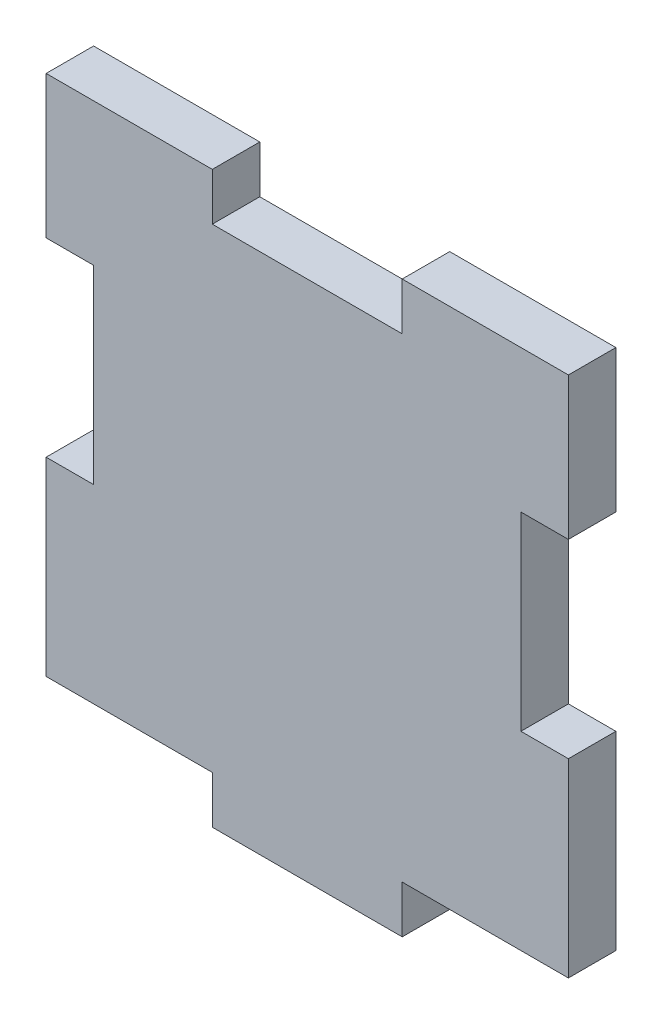
ISO-10303-21;
HEADER;
FILE_DESCRIPTION(('STEP AP214'),'2;1');
FILE_NAME('part.step','',(''),(''),'','','');
FILE_SCHEMA(('AUTOMOTIVE_DESIGN { 1 0 10303 214 1 1 1 1 }'));
ENDSEC;
DATA;
#1=APPLICATION_CONTEXT('core data for automotive mechanical design processes');
#2=APPLICATION_PROTOCOL_DEFINITION('international standard','automotive_design',2000,#1);
#3=PRODUCT_CONTEXT('',#1,'mechanical');
#4=PRODUCT('Part','Part','',(#3));
#5=PRODUCT_RELATED_PRODUCT_CATEGORY('part','',(#4));
#6=PRODUCT_DEFINITION_FORMATION('','',#4);
#7=PRODUCT_DEFINITION_CONTEXT('part definition',#1,'design');
#8=PRODUCT_DEFINITION('design','',#6,#7);
#9=PRODUCT_DEFINITION_SHAPE('','',#8);
#10=(LENGTH_UNIT() NAMED_UNIT(*) SI_UNIT(.MILLI.,.METRE.));
#11=(NAMED_UNIT(*) PLANE_ANGLE_UNIT() SI_UNIT($,.RADIAN.));
#12=(NAMED_UNIT(*) SI_UNIT($,.STERADIAN.) SOLID_ANGLE_UNIT());
#13=UNCERTAINTY_MEASURE_WITH_UNIT(LENGTH_MEASURE(1.E-05),#10,'distance_accuracy_value','');
#14=(GEOMETRIC_REPRESENTATION_CONTEXT(3) GLOBAL_UNCERTAINTY_ASSIGNED_CONTEXT((#13)) GLOBAL_UNIT_ASSIGNED_CONTEXT((#10,
#11,#12)) REPRESENTATION_CONTEXT('',''));
#15=CARTESIAN_POINT('',(0.,0.,0.));
#16=DIRECTION('',(0.,0.,1.));
#17=DIRECTION('',(1.,0.,0.));
#18=AXIS2_PLACEMENT_3D('',#15,#16,#17);
#19=CARTESIAN_POINT('',(0.,31.75,6.35));
#20=DIRECTION('',(1.,0.,0.));
#21=DIRECTION('',(0.,1.,0.));
#22=AXIS2_PLACEMENT_3D('',#19,#20,#21);
#23=PLANE('',#22);
#24=DIRECTION('',(0.,-1.,0.));
#25=VECTOR('',#24,1.);
#26=CARTESIAN_POINT('',(0.,31.75,0.));
#27=LINE('',#26,#25);
#28=CARTESIAN_POINT('',(0.,31.75,0.));
#29=VERTEX_POINT('',#28);
#30=CARTESIAN_POINT('',(0.,6.35,0.));
#31=VERTEX_POINT('',#30);
#32=EDGE_CURVE('E199',#29,#31,#27,.T.);
#33=ORIENTED_EDGE('',*,*,#32,.T.);
#34=DIRECTION('',(0.,0.,-1.));
#35=VECTOR('',#34,1.);
#36=CARTESIAN_POINT('',(0.,6.35,6.35));
#37=LINE('',#36,#35);
#38=CARTESIAN_POINT('',(0.,6.35,6.35));
#39=VERTEX_POINT('',#38);
#40=EDGE_CURVE('E11',#39,#31,#37,.T.);
#41=ORIENTED_EDGE('',*,*,#40,.F.);
#42=DIRECTION('',(0.,-1.,0.));
#43=VECTOR('',#42,1.);
#44=CARTESIAN_POINT('',(0.,31.75,6.35));
#45=LINE('',#44,#43);
#46=CARTESIAN_POINT('',(0.,31.75,6.35));
#47=VERTEX_POINT('',#46);
#48=EDGE_CURVE('E237',#47,#39,#45,.T.);
#49=ORIENTED_EDGE('',*,*,#48,.F.);
#50=DIRECTION('',(0.,0.,-1.));
#51=VECTOR('',#50,1.);
#52=CARTESIAN_POINT('',(0.,31.75,6.35));
#53=LINE('',#52,#51);
#54=EDGE_CURVE('E195',#47,#29,#53,.T.);
#55=ORIENTED_EDGE('',*,*,#54,.T.);
#56=EDGE_LOOP('',(#33,#41,#49,#55));
#57=FACE_BOUND('',#56,.T.);
#58=ADVANCED_FACE('F31',(#57),#23,.F.);
#59=CARTESIAN_POINT('',(0.,6.35,6.35));
#60=DIRECTION('',(0.,1.,0.));
#61=DIRECTION('',(-1.,0.,0.));
#62=AXIS2_PLACEMENT_3D('',#59,#60,#61);
#63=PLANE('',#62);
#64=DIRECTION('',(1.,0.,0.));
#65=VECTOR('',#64,1.);
#66=CARTESIAN_POINT('',(0.,6.35,0.));
#67=LINE('',#66,#65);
#68=CARTESIAN_POINT('',(22.225,6.34999999999999,0.));
#69=VERTEX_POINT('',#68);
#70=EDGE_CURVE('E202',#31,#69,#67,.T.);
#71=ORIENTED_EDGE('',*,*,#70,.T.);
#72=DIRECTION('',(0.,0.,-1.));
#73=VECTOR('',#72,1.);
#74=CARTESIAN_POINT('',(22.225,6.34999999999999,6.35));
#75=LINE('',#74,#73);
#76=CARTESIAN_POINT('',(22.225,6.34999999999999,6.35));
#77=VERTEX_POINT('',#76);
#78=EDGE_CURVE('E39',#77,#69,#75,.T.);
#79=ORIENTED_EDGE('',*,*,#78,.F.);
#80=DIRECTION('',(1.,0.,0.));
#81=VECTOR('',#80,1.);
#82=CARTESIAN_POINT('',(0.,6.35,6.35));
#83=LINE('',#82,#81);
#84=EDGE_CURVE('E126',#39,#77,#83,.T.);
#85=ORIENTED_EDGE('',*,*,#84,.F.);
#86=ORIENTED_EDGE('',*,*,#40,.T.);
#87=EDGE_LOOP('',(#71,#79,#85,#86));
#88=FACE_BOUND('',#87,.T.);
#89=ADVANCED_FACE('F355',(#88),#63,.F.);
#90=CARTESIAN_POINT('',(22.225,6.34999999999999,6.35));
#91=DIRECTION('',(1.,0.,0.));
#92=DIRECTION('',(0.,1.,0.));
#93=AXIS2_PLACEMENT_3D('',#90,#91,#92);
#94=PLANE('',#93);
#95=DIRECTION('',(0.,-1.,0.));
#96=VECTOR('',#95,1.);
#97=CARTESIAN_POINT('',(22.225,6.34999999999999,0.));
#98=LINE('',#97,#96);
#99=CARTESIAN_POINT('',(22.225,0.,0.));
#100=VERTEX_POINT('',#99);
#101=EDGE_CURVE('E204',#69,#100,#98,.T.);
#102=ORIENTED_EDGE('',*,*,#101,.T.);
#103=DIRECTION('',(0.,0.,-1.));
#104=VECTOR('',#103,1.);
#105=CARTESIAN_POINT('',(22.225,0.,6.35));
#106=LINE('',#105,#104);
#107=CARTESIAN_POINT('',(22.225,0.,6.35));
#108=VERTEX_POINT('',#107);
#109=EDGE_CURVE('E280',#108,#100,#106,.T.);
#110=ORIENTED_EDGE('',*,*,#109,.F.);
#111=DIRECTION('',(0.,-1.,0.));
#112=VECTOR('',#111,1.);
#113=CARTESIAN_POINT('',(22.225,6.34999999999999,6.35));
#114=LINE('',#113,#112);
#115=EDGE_CURVE('E288',#77,#108,#114,.T.);
#116=ORIENTED_EDGE('',*,*,#115,.F.);
#117=ORIENTED_EDGE('',*,*,#78,.T.);
#118=EDGE_LOOP('',(#102,#110,#116,#117));
#119=FACE_BOUND('',#118,.T.);
#120=ADVANCED_FACE('F286',(#119),#94,.F.);
#121=CARTESIAN_POINT('',(22.225,0.,6.35));
#122=DIRECTION('',(0.,1.,0.));
#123=DIRECTION('',(-1.,0.,0.));
#124=AXIS2_PLACEMENT_3D('',#121,#122,#123);
#125=PLANE('',#124);
#126=DIRECTION('',(1.,0.,0.));
#127=VECTOR('',#126,1.);
#128=CARTESIAN_POINT('',(22.225,0.,0.));
#129=LINE('',#128,#127);
#130=CARTESIAN_POINT('',(47.625,0.,0.));
#131=VERTEX_POINT('',#130);
#132=EDGE_CURVE('E206',#100,#131,#129,.T.);
#133=ORIENTED_EDGE('',*,*,#132,.T.);
#134=DIRECTION('',(0.,0.,-1.));
#135=VECTOR('',#134,1.);
#136=CARTESIAN_POINT('',(47.625,0.,6.35));
#137=LINE('',#136,#135);
#138=CARTESIAN_POINT('',(47.625,0.,6.35));
#139=VERTEX_POINT('',#138);
#140=EDGE_CURVE('E277',#139,#131,#137,.T.);
#141=ORIENTED_EDGE('',*,*,#140,.F.);
#142=DIRECTION('',(1.,0.,0.));
#143=VECTOR('',#142,1.);
#144=CARTESIAN_POINT('',(22.225,0.,6.35));
#145=LINE('',#144,#143);
#146=EDGE_CURVE('E306',#108,#139,#145,.T.);
#147=ORIENTED_EDGE('',*,*,#146,.F.);
#148=ORIENTED_EDGE('',*,*,#109,.T.);
#149=EDGE_LOOP('',(#133,#141,#147,#148));
#150=FACE_BOUND('',#149,.T.);
#151=ADVANCED_FACE('F297',(#150),#125,.F.);
#152=CARTESIAN_POINT('',(47.625,0.,6.35));
#153=DIRECTION('',(-1.,0.,0.));
#154=DIRECTION('',(0.,-1.,0.));
#155=AXIS2_PLACEMENT_3D('',#152,#153,#154);
#156=PLANE('',#155);
#157=DIRECTION('',(0.,1.,0.));
#158=VECTOR('',#157,1.);
#159=CARTESIAN_POINT('',(47.625,0.,0.));
#160=LINE('',#159,#158);
#161=CARTESIAN_POINT('',(47.625,6.35,0.));
#162=VERTEX_POINT('',#161);
#163=EDGE_CURVE('E208',#131,#162,#160,.T.);
#164=ORIENTED_EDGE('',*,*,#163,.T.);
#165=DIRECTION('',(0.,0.,-1.));
#166=VECTOR('',#165,1.);
#167=CARTESIAN_POINT('',(47.625,6.35,6.35));
#168=LINE('',#167,#166);
#169=CARTESIAN_POINT('',(47.625,6.35,6.35));
#170=VERTEX_POINT('',#169);
#171=EDGE_CURVE('E274',#170,#162,#168,.T.);
#172=ORIENTED_EDGE('',*,*,#171,.F.);
#173=DIRECTION('',(0.,1.,0.));
#174=VECTOR('',#173,1.);
#175=CARTESIAN_POINT('',(47.625,0.,6.35));
#176=LINE('',#175,#174);
#177=EDGE_CURVE('E303',#139,#170,#176,.T.);
#178=ORIENTED_EDGE('',*,*,#177,.F.);
#179=ORIENTED_EDGE('',*,*,#140,.T.);
#180=EDGE_LOOP('',(#164,#172,#178,#179));
#181=FACE_BOUND('',#180,.T.);
#182=ADVANCED_FACE('F301',(#181),#156,.F.);
#183=CARTESIAN_POINT('',(47.625,6.35,6.35));
#184=DIRECTION('',(0.,1.,0.));
#185=DIRECTION('',(-1.,0.,0.));
#186=AXIS2_PLACEMENT_3D('',#183,#184,#185);
#187=PLANE('',#186);
#188=DIRECTION('',(1.,0.,0.));
#189=VECTOR('',#188,1.);
#190=CARTESIAN_POINT('',(47.625,6.35,0.));
#191=LINE('',#190,#189);
#192=CARTESIAN_POINT('',(69.85,6.35,0.));
#193=VERTEX_POINT('',#192);
#194=EDGE_CURVE('E210',#162,#193,#191,.T.);
#195=ORIENTED_EDGE('',*,*,#194,.T.);
#196=DIRECTION('',(0.,0.,-1.));
#197=VECTOR('',#196,1.);
#198=CARTESIAN_POINT('',(69.85,6.35,6.35));
#199=LINE('',#198,#197);
#200=CARTESIAN_POINT('',(69.85,6.35,6.35));
#201=VERTEX_POINT('',#200);
#202=EDGE_CURVE('E271',#201,#193,#199,.T.);
#203=ORIENTED_EDGE('',*,*,#202,.F.);
#204=DIRECTION('',(1.,0.,0.));
#205=VECTOR('',#204,1.);
#206=CARTESIAN_POINT('',(47.625,6.35,6.35));
#207=LINE('',#206,#205);
#208=EDGE_CURVE('E305',#170,#201,#207,.T.);
#209=ORIENTED_EDGE('',*,*,#208,.F.);
#210=ORIENTED_EDGE('',*,*,#171,.T.);
#211=EDGE_LOOP('',(#195,#203,#209,#210));
#212=FACE_BOUND('',#211,.T.);
#213=ADVANCED_FACE('F368',(#212),#187,.F.);
#214=CARTESIAN_POINT('',(69.85,6.35,6.35));
#215=DIRECTION('',(-1.,0.,0.));
#216=DIRECTION('',(0.,0.,1.));
#217=AXIS2_PLACEMENT_3D('',#214,#215,#216);
#218=PLANE('',#217);
#219=DIRECTION('',(0.,1.,0.));
#220=VECTOR('',#219,1.);
#221=CARTESIAN_POINT('',(69.85,6.35,0.));
#222=LINE('',#221,#220);
#223=CARTESIAN_POINT('',(69.85,31.75,0.));
#224=VERTEX_POINT('',#223);
#225=EDGE_CURVE('E212',#193,#224,#222,.T.);
#226=ORIENTED_EDGE('',*,*,#225,.T.);
#227=DIRECTION('',(0.,0.,-1.));
#228=VECTOR('',#227,1.);
#229=CARTESIAN_POINT('',(69.85,31.75,6.35));
#230=LINE('',#229,#228);
#231=CARTESIAN_POINT('',(69.85,31.75,6.35));
#232=VERTEX_POINT('',#231);
#233=EDGE_CURVE('E268',#232,#224,#230,.T.);
#234=ORIENTED_EDGE('',*,*,#233,.F.);
#235=DIRECTION('',(0.,1.,0.));
#236=VECTOR('',#235,1.);
#237=CARTESIAN_POINT('',(69.85,6.35,6.35));
#238=LINE('',#237,#236);
#239=EDGE_CURVE('E308',#201,#232,#238,.T.);
#240=ORIENTED_EDGE('',*,*,#239,.F.);
#241=ORIENTED_EDGE('',*,*,#202,.T.);
#242=EDGE_LOOP('',(#226,#234,#240,#241));
#243=FACE_BOUND('',#242,.T.);
#244=ADVANCED_FACE('F371',(#243),#218,.F.);
#245=CARTESIAN_POINT('',(63.5,31.75,6.35));
#246=DIRECTION('',(0.,-1.,0.));
#247=DIRECTION('',(1.,0.,0.));
#248=AXIS2_PLACEMENT_3D('',#245,#246,#247);
#249=PLANE('',#248);
#250=DIRECTION('',(-1.,0.,0.));
#251=VECTOR('',#250,1.);
#252=CARTESIAN_POINT('',(63.5,31.75,0.));
#253=LINE('',#252,#251);
#254=CARTESIAN_POINT('',(63.5,31.75,0.));
#255=VERTEX_POINT('',#254);
#256=EDGE_CURVE('E214',#224,#255,#253,.T.);
#257=ORIENTED_EDGE('',*,*,#256,.T.);
#258=DIRECTION('',(0.,0.,-1.));
#259=VECTOR('',#258,1.);
#260=CARTESIAN_POINT('',(63.5,31.75,6.35));
#261=LINE('',#260,#259);
#262=CARTESIAN_POINT('',(63.5,31.75,6.35));
#263=VERTEX_POINT('',#262);
#264=EDGE_CURVE('E265',#263,#255,#261,.T.);
#265=ORIENTED_EDGE('',*,*,#264,.F.);
#266=DIRECTION('',(-1.,0.,0.));
#267=VECTOR('',#266,1.);
#268=CARTESIAN_POINT('',(63.5,31.75,6.35));
#269=LINE('',#268,#267);
#270=EDGE_CURVE('E314',#232,#263,#269,.T.);
#271=ORIENTED_EDGE('',*,*,#270,.F.);
#272=ORIENTED_EDGE('',*,*,#233,.T.);
#273=EDGE_LOOP('',(#257,#265,#271,#272));
#274=FACE_BOUND('',#273,.T.);
#275=ADVANCED_FACE('F375',(#274),#249,.F.);
#276=CARTESIAN_POINT('',(63.5,57.15,6.35));
#277=DIRECTION('',(-1.,0.,0.));
#278=DIRECTION('',(0.,-1.,0.));
#279=AXIS2_PLACEMENT_3D('',#276,#277,#278);
#280=PLANE('',#279);
#281=DIRECTION('',(0.,1.,0.));
#282=VECTOR('',#281,1.);
#283=CARTESIAN_POINT('',(63.5,57.15,0.));
#284=LINE('',#283,#282);
#285=CARTESIAN_POINT('',(63.5,57.15,0.));
#286=VERTEX_POINT('',#285);
#287=EDGE_CURVE('E216',#255,#286,#284,.T.);
#288=ORIENTED_EDGE('',*,*,#287,.T.);
#289=DIRECTION('',(0.,0.,-1.));
#290=VECTOR('',#289,1.);
#291=CARTESIAN_POINT('',(63.5,57.15,6.35));
#292=LINE('',#291,#290);
#293=CARTESIAN_POINT('',(63.5,57.15,6.35));
#294=VERTEX_POINT('',#293);
#295=EDGE_CURVE('E262',#294,#286,#292,.T.);
#296=ORIENTED_EDGE('',*,*,#295,.F.);
#297=DIRECTION('',(0.,1.,0.));
#298=VECTOR('',#297,1.);
#299=CARTESIAN_POINT('',(63.5,57.15,6.35));
#300=LINE('',#299,#298);
#301=EDGE_CURVE('E316',#263,#294,#300,.T.);
#302=ORIENTED_EDGE('',*,*,#301,.F.);
#303=ORIENTED_EDGE('',*,*,#264,.T.);
#304=EDGE_LOOP('',(#288,#296,#302,#303));
#305=FACE_BOUND('',#304,.T.);
#306=ADVANCED_FACE('F379',(#305),#280,.F.);
#307=CARTESIAN_POINT('',(69.85,57.15,6.35));
#308=DIRECTION('',(0.,1.,0.));
#309=DIRECTION('',(-1.,0.,0.));
#310=AXIS2_PLACEMENT_3D('',#307,#308,#309);
#311=PLANE('',#310);
#312=DIRECTION('',(1.,0.,0.));
#313=VECTOR('',#312,1.);
#314=CARTESIAN_POINT('',(69.85,57.15,0.));
#315=LINE('',#314,#313);
#316=CARTESIAN_POINT('',(69.85,57.15,0.));
#317=VERTEX_POINT('',#316);
#318=EDGE_CURVE('E218',#286,#317,#315,.T.);
#319=ORIENTED_EDGE('',*,*,#318,.T.);
#320=DIRECTION('',(0.,0.,-1.));
#321=VECTOR('',#320,1.);
#322=CARTESIAN_POINT('',(69.85,57.15,6.35));
#323=LINE('',#322,#321);
#324=CARTESIAN_POINT('',(69.85,57.15,6.35));
#325=VERTEX_POINT('',#324);
#326=EDGE_CURVE('E259',#325,#317,#323,.T.);
#327=ORIENTED_EDGE('',*,*,#326,.F.);
#328=DIRECTION('',(1.,0.,0.));
#329=VECTOR('',#328,1.);
#330=CARTESIAN_POINT('',(69.85,57.15,6.35));
#331=LINE('',#330,#329);
#332=EDGE_CURVE('E318',#294,#325,#331,.T.);
#333=ORIENTED_EDGE('',*,*,#332,.F.);
#334=ORIENTED_EDGE('',*,*,#295,.T.);
#335=EDGE_LOOP('',(#319,#327,#333,#334));
#336=FACE_BOUND('',#335,.T.);
#337=ADVANCED_FACE('F383',(#336),#311,.F.);
#338=CARTESIAN_POINT('',(69.85,57.15,6.35));
#339=DIRECTION('',(-1.,0.,0.));
#340=DIRECTION('',(0.,0.,1.));
#341=AXIS2_PLACEMENT_3D('',#338,#339,#340);
#342=PLANE('',#341);
#343=DIRECTION('',(0.,1.,0.));
#344=VECTOR('',#343,1.);
#345=CARTESIAN_POINT('',(69.85,57.15,0.));
#346=LINE('',#345,#344);
#347=CARTESIAN_POINT('',(69.85,76.2,0.));
#348=VERTEX_POINT('',#347);
#349=EDGE_CURVE('E220',#317,#348,#346,.T.);
#350=ORIENTED_EDGE('',*,*,#349,.T.);
#351=DIRECTION('',(0.,0.,-1.));
#352=VECTOR('',#351,1.);
#353=CARTESIAN_POINT('',(69.85,76.2,6.35));
#354=LINE('',#353,#352);
#355=CARTESIAN_POINT('',(69.85,76.2,6.35));
#356=VERTEX_POINT('',#355);
#357=EDGE_CURVE('E256',#356,#348,#354,.T.);
#358=ORIENTED_EDGE('',*,*,#357,.F.);
#359=DIRECTION('',(0.,1.,0.));
#360=VECTOR('',#359,1.);
#361=CARTESIAN_POINT('',(69.85,57.15,6.35));
#362=LINE('',#361,#360);
#363=EDGE_CURVE('E320',#325,#356,#362,.T.);
#364=ORIENTED_EDGE('',*,*,#363,.F.);
#365=ORIENTED_EDGE('',*,*,#326,.T.);
#366=EDGE_LOOP('',(#350,#358,#364,#365));
#367=FACE_BOUND('',#366,.T.);
#368=ADVANCED_FACE('F387',(#367),#342,.F.);
#369=CARTESIAN_POINT('',(69.85,76.2,6.35));
#370=DIRECTION('',(0.,-1.,0.));
#371=DIRECTION('',(1.,0.,0.));
#372=AXIS2_PLACEMENT_3D('',#369,#370,#371);
#373=PLANE('',#372);
#374=DIRECTION('',(-1.,0.,0.));
#375=VECTOR('',#374,1.);
#376=CARTESIAN_POINT('',(69.85,76.2,0.));
#377=LINE('',#376,#375);
#378=CARTESIAN_POINT('',(47.625,76.2,0.));
#379=VERTEX_POINT('',#378);
#380=EDGE_CURVE('E222',#348,#379,#377,.T.);
#381=ORIENTED_EDGE('',*,*,#380,.T.);
#382=DIRECTION('',(0.,0.,-1.));
#383=VECTOR('',#382,1.);
#384=CARTESIAN_POINT('',(47.625,76.2,6.35));
#385=LINE('',#384,#383);
#386=CARTESIAN_POINT('',(47.625,76.2,6.35));
#387=VERTEX_POINT('',#386);
#388=EDGE_CURVE('E253',#387,#379,#385,.T.);
#389=ORIENTED_EDGE('',*,*,#388,.F.);
#390=DIRECTION('',(-1.,0.,0.));
#391=VECTOR('',#390,1.);
#392=CARTESIAN_POINT('',(69.85,76.2,6.35));
#393=LINE('',#392,#391);
#394=EDGE_CURVE('E322',#356,#387,#393,.T.);
#395=ORIENTED_EDGE('',*,*,#394,.F.);
#396=ORIENTED_EDGE('',*,*,#357,.T.);
#397=EDGE_LOOP('',(#381,#389,#395,#396));
#398=FACE_BOUND('',#397,.T.);
#399=ADVANCED_FACE('F391',(#398),#373,.F.);
#400=CARTESIAN_POINT('',(47.625,69.85,6.35));
#401=DIRECTION('',(1.,0.,0.));
#402=DIRECTION('',(0.,1.,0.));
#403=AXIS2_PLACEMENT_3D('',#400,#401,#402);
#404=PLANE('',#403);
#405=DIRECTION('',(0.,-1.,0.));
#406=VECTOR('',#405,1.);
#407=CARTESIAN_POINT('',(47.625,69.85,0.));
#408=LINE('',#407,#406);
#409=CARTESIAN_POINT('',(47.625,69.85,0.));
#410=VERTEX_POINT('',#409);
#411=EDGE_CURVE('E224',#379,#410,#408,.T.);
#412=ORIENTED_EDGE('',*,*,#411,.T.);
#413=DIRECTION('',(0.,0.,-1.));
#414=VECTOR('',#413,1.);
#415=CARTESIAN_POINT('',(47.625,69.85,6.35));
#416=LINE('',#415,#414);
#417=CARTESIAN_POINT('',(47.625,69.85,6.35));
#418=VERTEX_POINT('',#417);
#419=EDGE_CURVE('E250',#418,#410,#416,.T.);
#420=ORIENTED_EDGE('',*,*,#419,.F.);
#421=DIRECTION('',(0.,-1.,0.));
#422=VECTOR('',#421,1.);
#423=CARTESIAN_POINT('',(47.625,69.85,6.35));
#424=LINE('',#423,#422);
#425=EDGE_CURVE('E324',#387,#418,#424,.T.);
#426=ORIENTED_EDGE('',*,*,#425,.F.);
#427=ORIENTED_EDGE('',*,*,#388,.T.);
#428=EDGE_LOOP('',(#412,#420,#426,#427));
#429=FACE_BOUND('',#428,.T.);
#430=ADVANCED_FACE('F395',(#429),#404,.F.);
#431=CARTESIAN_POINT('',(22.225,69.85,6.35));
#432=DIRECTION('',(0.,-1.,0.));
#433=DIRECTION('',(0.,0.,-1.));
#434=AXIS2_PLACEMENT_3D('',#431,#432,#433);
#435=PLANE('',#434);
#436=DIRECTION('',(-1.,0.,0.));
#437=VECTOR('',#436,1.);
#438=CARTESIAN_POINT('',(22.225,69.85,0.));
#439=LINE('',#438,#437);
#440=CARTESIAN_POINT('',(22.225,69.85,0.));
#441=VERTEX_POINT('',#440);
#442=EDGE_CURVE('E226',#410,#441,#439,.T.);
#443=ORIENTED_EDGE('',*,*,#442,.T.);
#444=DIRECTION('',(0.,0.,-1.));
#445=VECTOR('',#444,1.);
#446=CARTESIAN_POINT('',(22.225,69.85,6.35));
#447=LINE('',#446,#445);
#448=CARTESIAN_POINT('',(22.225,69.85,6.35));
#449=VERTEX_POINT('',#448);
#450=EDGE_CURVE('E247',#449,#441,#447,.T.);
#451=ORIENTED_EDGE('',*,*,#450,.F.);
#452=DIRECTION('',(-1.,0.,0.));
#453=VECTOR('',#452,1.);
#454=CARTESIAN_POINT('',(22.225,69.85,6.35));
#455=LINE('',#454,#453);
#456=EDGE_CURVE('E326',#418,#449,#455,.T.);
#457=ORIENTED_EDGE('',*,*,#456,.F.);
#458=ORIENTED_EDGE('',*,*,#419,.T.);
#459=EDGE_LOOP('',(#443,#451,#457,#458));
#460=FACE_BOUND('',#459,.T.);
#461=ADVANCED_FACE('F399',(#460),#435,.F.);
#462=CARTESIAN_POINT('',(22.225,76.2,6.35));
#463=DIRECTION('',(-1.,0.,0.));
#464=DIRECTION('',(0.,-1.,0.));
#465=AXIS2_PLACEMENT_3D('',#462,#463,#464);
#466=PLANE('',#465);
#467=DIRECTION('',(0.,1.,0.));
#468=VECTOR('',#467,1.);
#469=CARTESIAN_POINT('',(22.225,76.2,0.));
#470=LINE('',#469,#468);
#471=CARTESIAN_POINT('',(22.225,76.2,0.));
#472=VERTEX_POINT('',#471);
#473=EDGE_CURVE('E228',#441,#472,#470,.T.);
#474=ORIENTED_EDGE('',*,*,#473,.T.);
#475=DIRECTION('',(0.,0.,-1.));
#476=VECTOR('',#475,1.);
#477=CARTESIAN_POINT('',(22.225,76.2,6.35));
#478=LINE('',#477,#476);
#479=CARTESIAN_POINT('',(22.225,76.2,6.35));
#480=VERTEX_POINT('',#479);
#481=EDGE_CURVE('E244',#480,#472,#478,.T.);
#482=ORIENTED_EDGE('',*,*,#481,.F.);
#483=DIRECTION('',(0.,1.,0.));
#484=VECTOR('',#483,1.);
#485=CARTESIAN_POINT('',(22.225,76.2,6.35));
#486=LINE('',#485,#484);
#487=EDGE_CURVE('E328',#449,#480,#486,.T.);
#488=ORIENTED_EDGE('',*,*,#487,.F.);
#489=ORIENTED_EDGE('',*,*,#450,.T.);
#490=EDGE_LOOP('',(#474,#482,#488,#489));
#491=FACE_BOUND('',#490,.T.);
#492=ADVANCED_FACE('F403',(#491),#466,.F.);
#493=CARTESIAN_POINT('',(22.225,76.2,6.35));
#494=DIRECTION('',(0.,-1.,0.));
#495=DIRECTION('',(0.,0.,-1.));
#496=AXIS2_PLACEMENT_3D('',#493,#494,#495);
#497=PLANE('',#496);
#498=DIRECTION('',(-1.,0.,0.));
#499=VECTOR('',#498,1.);
#500=CARTESIAN_POINT('',(22.225,76.2,0.));
#501=LINE('',#500,#499);
#502=CARTESIAN_POINT('',(0.,76.2,0.));
#503=VERTEX_POINT('',#502);
#504=EDGE_CURVE('E230',#472,#503,#501,.T.);
#505=ORIENTED_EDGE('',*,*,#504,.T.);
#506=DIRECTION('',(0.,0.,-1.));
#507=VECTOR('',#506,1.);
#508=CARTESIAN_POINT('',(0.,76.2,6.35));
#509=LINE('',#508,#507);
#510=CARTESIAN_POINT('',(0.,76.2,6.35));
#511=VERTEX_POINT('',#510);
#512=EDGE_CURVE('E241',#511,#503,#509,.T.);
#513=ORIENTED_EDGE('',*,*,#512,.F.);
#514=DIRECTION('',(-1.,0.,0.));
#515=VECTOR('',#514,1.);
#516=CARTESIAN_POINT('',(22.225,76.2,6.35));
#517=LINE('',#516,#515);
#518=EDGE_CURVE('E330',#480,#511,#517,.T.);
#519=ORIENTED_EDGE('',*,*,#518,.F.);
#520=ORIENTED_EDGE('',*,*,#481,.T.);
#521=EDGE_LOOP('',(#505,#513,#519,#520));
#522=FACE_BOUND('',#521,.T.);
#523=ADVANCED_FACE('F336',(#522),#497,.F.);
#524=CARTESIAN_POINT('',(0.,76.2,6.35));
#525=DIRECTION('',(1.,0.,0.));
#526=DIRECTION('',(0.,1.,0.));
#527=AXIS2_PLACEMENT_3D('',#524,#525,#526);
#528=PLANE('',#527);
#529=DIRECTION('',(0.,-1.,0.));
#530=VECTOR('',#529,1.);
#531=CARTESIAN_POINT('',(0.,76.2,0.));
#532=LINE('',#531,#530);
#533=CARTESIAN_POINT('',(0.,57.15,0.));
#534=VERTEX_POINT('',#533);
#535=EDGE_CURVE('E232',#503,#534,#532,.T.);
#536=ORIENTED_EDGE('',*,*,#535,.T.);
#537=DIRECTION('',(0.,0.,-1.));
#538=VECTOR('',#537,1.);
#539=CARTESIAN_POINT('',(0.,57.15,6.35));
#540=LINE('',#539,#538);
#541=CARTESIAN_POINT('',(0.,57.15,6.35));
#542=VERTEX_POINT('',#541);
#543=EDGE_CURVE('E190',#542,#534,#540,.T.);
#544=ORIENTED_EDGE('',*,*,#543,.F.);
#545=DIRECTION('',(0.,-1.,0.));
#546=VECTOR('',#545,1.);
#547=CARTESIAN_POINT('',(0.,76.2,6.35));
#548=LINE('',#547,#546);
#549=EDGE_CURVE('E181',#511,#542,#548,.T.);
#550=ORIENTED_EDGE('',*,*,#549,.F.);
#551=ORIENTED_EDGE('',*,*,#512,.T.);
#552=EDGE_LOOP('',(#536,#544,#550,#551));
#553=FACE_BOUND('',#552,.T.);
#554=ADVANCED_FACE('F340',(#553),#528,.F.);
#555=CARTESIAN_POINT('',(0.,57.15,6.35));
#556=DIRECTION('',(0.,1.,0.));
#557=DIRECTION('',(0.,0.,1.));
#558=AXIS2_PLACEMENT_3D('',#555,#556,#557);
#559=PLANE('',#558);
#560=DIRECTION('',(1.,0.,0.));
#561=VECTOR('',#560,1.);
#562=CARTESIAN_POINT('',(0.,57.15,0.));
#563=LINE('',#562,#561);
#564=CARTESIAN_POINT('',(6.35,57.15,0.));
#565=VERTEX_POINT('',#564);
#566=EDGE_CURVE('E189',#534,#565,#563,.T.);
#567=ORIENTED_EDGE('',*,*,#566,.T.);
#568=DIRECTION('',(0.,0.,-1.));
#569=VECTOR('',#568,1.);
#570=CARTESIAN_POINT('',(6.35,57.15,6.35));
#571=LINE('',#570,#569);
#572=CARTESIAN_POINT('',(6.35,57.15,6.35));
#573=VERTEX_POINT('',#572);
#574=EDGE_CURVE('E186',#573,#565,#571,.T.);
#575=ORIENTED_EDGE('',*,*,#574,.F.);
#576=DIRECTION('',(1.,0.,0.));
#577=VECTOR('',#576,1.);
#578=CARTESIAN_POINT('',(0.,57.15,6.35));
#579=LINE('',#578,#577);
#580=EDGE_CURVE('E175',#542,#573,#579,.T.);
#581=ORIENTED_EDGE('',*,*,#580,.F.);
#582=ORIENTED_EDGE('',*,*,#543,.T.);
#583=EDGE_LOOP('',(#567,#575,#581,#582));
#584=FACE_BOUND('',#583,.T.);
#585=ADVANCED_FACE('F187',(#584),#559,.F.);
#586=CARTESIAN_POINT('',(6.35,57.15,6.35));
#587=DIRECTION('',(1.,0.,0.));
#588=DIRECTION('',(0.,1.,0.));
#589=AXIS2_PLACEMENT_3D('',#586,#587,#588);
#590=PLANE('',#589);
#591=DIRECTION('',(0.,-1.,0.));
#592=VECTOR('',#591,1.);
#593=CARTESIAN_POINT('',(6.35,57.15,0.));
#594=LINE('',#593,#592);
#595=CARTESIAN_POINT('',(6.35000000000001,31.75,0.));
#596=VERTEX_POINT('',#595);
#597=EDGE_CURVE('E112',#565,#596,#594,.T.);
#598=ORIENTED_EDGE('',*,*,#597,.T.);
#599=DIRECTION('',(0.,0.,-1.));
#600=VECTOR('',#599,1.);
#601=CARTESIAN_POINT('',(6.35000000000001,31.75,6.35));
#602=LINE('',#601,#600);
#603=CARTESIAN_POINT('',(6.35000000000001,31.75,6.35));
#604=VERTEX_POINT('',#603);
#605=EDGE_CURVE('E191',#604,#596,#602,.T.);
#606=ORIENTED_EDGE('',*,*,#605,.F.);
#607=DIRECTION('',(0.,-1.,0.));
#608=VECTOR('',#607,1.);
#609=CARTESIAN_POINT('',(6.35,57.15,6.35));
#610=LINE('',#609,#608);
#611=EDGE_CURVE('E179',#573,#604,#610,.T.);
#612=ORIENTED_EDGE('',*,*,#611,.F.);
#613=ORIENTED_EDGE('',*,*,#574,.T.);
#614=EDGE_LOOP('',(#598,#606,#612,#613));
#615=FACE_BOUND('',#614,.T.);
#616=ADVANCED_FACE('F193',(#615),#590,.F.);
#617=CARTESIAN_POINT('',(6.35000000000001,31.75,6.35));
#618=DIRECTION('',(0.,-1.,0.));
#619=DIRECTION('',(0.,0.,-1.));
#620=AXIS2_PLACEMENT_3D('',#617,#618,#619);
#621=PLANE('',#620);
#622=DIRECTION('',(-1.,0.,0.));
#623=VECTOR('',#622,1.);
#624=CARTESIAN_POINT('',(6.35000000000001,31.75,0.));
#625=LINE('',#624,#623);
#626=EDGE_CURVE('E118',#596,#29,#625,.T.);
#627=ORIENTED_EDGE('',*,*,#626,.T.);
#628=ORIENTED_EDGE('',*,*,#54,.F.);
#629=DIRECTION('',(-1.,0.,0.));
#630=VECTOR('',#629,1.);
#631=CARTESIAN_POINT('',(6.35000000000001,31.75,6.35));
#632=LINE('',#631,#630);
#633=EDGE_CURVE('E47',#604,#47,#632,.T.);
#634=ORIENTED_EDGE('',*,*,#633,.F.);
#635=ORIENTED_EDGE('',*,*,#605,.T.);
#636=EDGE_LOOP('',(#627,#628,#634,#635));
#637=FACE_BOUND('',#636,.T.);
#638=ADVANCED_FACE('F344',(#637),#621,.F.);
#639=CARTESIAN_POINT('',(0.,6.35,6.35));
#640=DIRECTION('',(0.,0.,1.));
#641=DIRECTION('',(1.,0.,0.));
#642=AXIS2_PLACEMENT_3D('',#639,#640,#641);
#643=PLANE('',#642);
#644=ORIENTED_EDGE('',*,*,#48,.T.);
#645=ORIENTED_EDGE('',*,*,#84,.T.);
#646=ORIENTED_EDGE('',*,*,#115,.T.);
#647=ORIENTED_EDGE('',*,*,#146,.T.);
#648=ORIENTED_EDGE('',*,*,#177,.T.);
#649=ORIENTED_EDGE('',*,*,#208,.T.);
#650=ORIENTED_EDGE('',*,*,#239,.T.);
#651=ORIENTED_EDGE('',*,*,#270,.T.);
#652=ORIENTED_EDGE('',*,*,#301,.T.);
#653=ORIENTED_EDGE('',*,*,#332,.T.);
#654=ORIENTED_EDGE('',*,*,#363,.T.);
#655=ORIENTED_EDGE('',*,*,#394,.T.);
#656=ORIENTED_EDGE('',*,*,#425,.T.);
#657=ORIENTED_EDGE('',*,*,#456,.T.);
#658=ORIENTED_EDGE('',*,*,#487,.T.);
#659=ORIENTED_EDGE('',*,*,#518,.T.);
#660=ORIENTED_EDGE('',*,*,#549,.T.);
#661=ORIENTED_EDGE('',*,*,#580,.T.);
#662=ORIENTED_EDGE('',*,*,#611,.T.);
#663=ORIENTED_EDGE('',*,*,#633,.T.);
#664=EDGE_LOOP('',(#644,#645,#646,#647,#648,#649,#650,#651,#652,#653,#654,#655,#656,#657,#658,
#659,#660,#661,#662,#663));
#665=FACE_BOUND('',#664,.T.);
#666=ADVANCED_FACE('F177',(#665),#643,.T.);
#667=CARTESIAN_POINT('',(0.,6.35,0.));
#668=DIRECTION('',(0.,0.,1.));
#669=DIRECTION('',(1.,0.,0.));
#670=AXIS2_PLACEMENT_3D('',#667,#668,#669);
#671=PLANE('',#670);
#672=ORIENTED_EDGE('',*,*,#32,.F.);
#673=ORIENTED_EDGE('',*,*,#626,.F.);
#674=ORIENTED_EDGE('',*,*,#597,.F.);
#675=ORIENTED_EDGE('',*,*,#566,.F.);
#676=ORIENTED_EDGE('',*,*,#535,.F.);
#677=ORIENTED_EDGE('',*,*,#504,.F.);
#678=ORIENTED_EDGE('',*,*,#473,.F.);
#679=ORIENTED_EDGE('',*,*,#442,.F.);
#680=ORIENTED_EDGE('',*,*,#411,.F.);
#681=ORIENTED_EDGE('',*,*,#380,.F.);
#682=ORIENTED_EDGE('',*,*,#349,.F.);
#683=ORIENTED_EDGE('',*,*,#318,.F.);
#684=ORIENTED_EDGE('',*,*,#287,.F.);
#685=ORIENTED_EDGE('',*,*,#256,.F.);
#686=ORIENTED_EDGE('',*,*,#225,.F.);
#687=ORIENTED_EDGE('',*,*,#194,.F.);
#688=ORIENTED_EDGE('',*,*,#163,.F.);
#689=ORIENTED_EDGE('',*,*,#132,.F.);
#690=ORIENTED_EDGE('',*,*,#101,.F.);
#691=ORIENTED_EDGE('',*,*,#70,.F.);
#692=EDGE_LOOP('',(#672,#673,#674,#675,#676,#677,#678,#679,#680,#681,#682,#683,#684,#685,#686,
#687,#688,#689,#690,#691));
#693=FACE_BOUND('',#692,.T.);
#694=ADVANCED_FACE('F292',(#693),#671,.F.);
#695=CLOSED_SHELL('',(#58,#89,#120,#151,#182,#213,#244,#275,#306,#337,#368,#399,#430,#461,#492,
#523,#554,#585,#616,#638,#666,#694));
#696=MANIFOLD_SOLID_BREP('B2',#695);
#697=ADVANCED_BREP_SHAPE_REPRESENTATION('',(#18,#696),#14);
#698=SHAPE_DEFINITION_REPRESENTATION(#9,#697);
ENDSEC;
END-ISO-10303-21;
